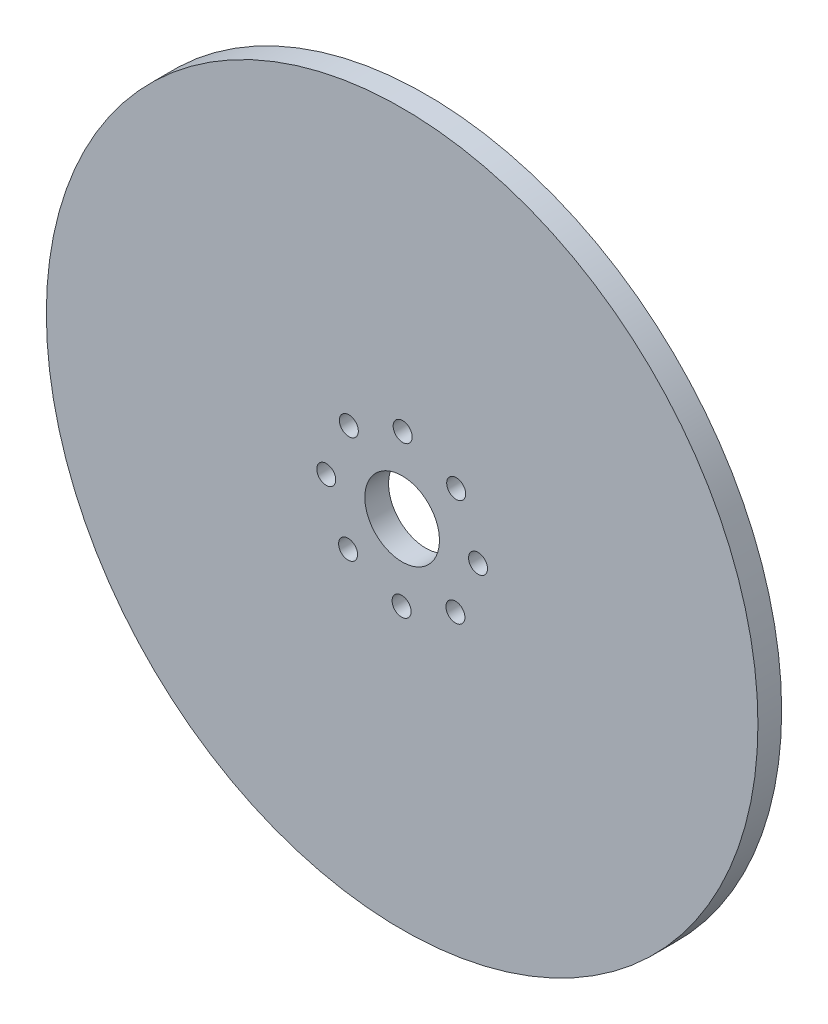
ISO-10303-21;
HEADER;
FILE_DESCRIPTION(('STEP AP214'),'2;1');
FILE_NAME('part.step','',(''),(''),'','','');
FILE_SCHEMA(('AUTOMOTIVE_DESIGN { 1 0 10303 214 1 1 1 1 }'));
ENDSEC;
DATA;
#1=APPLICATION_CONTEXT('core data for automotive mechanical design processes');
#2=APPLICATION_PROTOCOL_DEFINITION('international standard','automotive_design',2000,#1);
#3=PRODUCT_CONTEXT('',#1,'mechanical');
#4=PRODUCT('Part','Part','',(#3));
#5=PRODUCT_RELATED_PRODUCT_CATEGORY('part','',(#4));
#6=PRODUCT_DEFINITION_FORMATION('','',#4);
#7=PRODUCT_DEFINITION_CONTEXT('part definition',#1,'design');
#8=PRODUCT_DEFINITION('design','',#6,#7);
#9=PRODUCT_DEFINITION_SHAPE('','',#8);
#10=(LENGTH_UNIT() NAMED_UNIT(*) SI_UNIT(.MILLI.,.METRE.));
#11=(NAMED_UNIT(*) PLANE_ANGLE_UNIT() SI_UNIT($,.RADIAN.));
#12=(NAMED_UNIT(*) SI_UNIT($,.STERADIAN.) SOLID_ANGLE_UNIT());
#13=UNCERTAINTY_MEASURE_WITH_UNIT(LENGTH_MEASURE(1.E-05),#10,'distance_accuracy_value','');
#14=(GEOMETRIC_REPRESENTATION_CONTEXT(3) GLOBAL_UNCERTAINTY_ASSIGNED_CONTEXT((#13)) GLOBAL_UNIT_ASSIGNED_CONTEXT((#10,
#11,#12)) REPRESENTATION_CONTEXT('',''));
#15=CARTESIAN_POINT('',(0.,0.,0.));
#16=DIRECTION('',(0.,0.,1.));
#17=DIRECTION('',(1.,0.,0.));
#18=AXIS2_PLACEMENT_3D('',#15,#16,#17);
#19=CARTESIAN_POINT('',(0.,0.,2.5));
#20=DIRECTION('',(0.,0.,-1.));
#21=DIRECTION('',(-1.,0.,0.));
#22=AXIS2_PLACEMENT_3D('',#19,#20,#21);
#23=CYLINDRICAL_SURFACE('',#22,37.5);
#24=CARTESIAN_POINT('',(0.,0.,2.5));
#25=DIRECTION('',(0.,0.,1.));
#26=DIRECTION('',(1.,0.,0.));
#27=AXIS2_PLACEMENT_3D('',#24,#25,#26);
#28=CIRCLE('',#27,37.5);
#29=CARTESIAN_POINT('',(37.5,0.,2.5));
#30=VERTEX_POINT('',#29);
#31=EDGE_CURVE('E10',#30,#30,#28,.T.);
#32=ORIENTED_EDGE('',*,*,#31,.F.);
#33=EDGE_LOOP('',(#32));
#34=FACE_BOUND('',#33,.T.);
#35=CARTESIAN_POINT('',(0.,0.,0.));
#36=DIRECTION('',(0.,0.,1.));
#37=DIRECTION('',(1.,0.,0.));
#38=AXIS2_PLACEMENT_3D('',#35,#36,#37);
#39=CIRCLE('',#38,37.5);
#40=CARTESIAN_POINT('',(37.5,0.,0.));
#41=VERTEX_POINT('',#40);
#42=EDGE_CURVE('E40',#41,#41,#39,.T.);
#43=ORIENTED_EDGE('',*,*,#42,.T.);
#44=EDGE_LOOP('',(#43));
#45=FACE_BOUND('',#44,.T.);
#46=ADVANCED_FACE('F37',(#34,#45),#23,.T.);
#47=CARTESIAN_POINT('',(0.,0.,2.5));
#48=DIRECTION('',(0.,0.,1.));
#49=DIRECTION('',(1.,0.,0.));
#50=AXIS2_PLACEMENT_3D('',#47,#48,#49);
#51=PLANE('',#50);
#52=CARTESIAN_POINT('',(-0.056499269216726,-7.99980048704828,2.5));
#53=DIRECTION('',(0.,0.,-1.));
#54=DIRECTION('',(-1.,0.,0.));
#55=AXIS2_PLACEMENT_3D('',#52,#53,#54);
#56=CIRCLE('',#55,0.999999999999998);
#57=CARTESIAN_POINT('',(-1.05649926921672,-7.99980048704828,2.5));
#58=VERTEX_POINT('',#57);
#59=EDGE_CURVE('E74',#58,#58,#56,.T.);
#60=ORIENTED_EDGE('',*,*,#59,.T.);
#61=EDGE_LOOP('',(#60));
#62=FACE_BOUND('',#61,.T.);
#63=CARTESIAN_POINT('',(5.61676215613567,-5.69666418892614,2.5));
#64=DIRECTION('',(0.,0.,-1.));
#65=DIRECTION('',(-1.,0.,0.));
#66=AXIS2_PLACEMENT_3D('',#63,#64,#65);
#67=CIRCLE('',#66,0.999999999999998);
#68=CARTESIAN_POINT('',(4.61676215613568,-5.69666418892614,2.5));
#69=VERTEX_POINT('',#68);
#70=EDGE_CURVE('E68',#69,#69,#67,.T.);
#71=ORIENTED_EDGE('',*,*,#70,.T.);
#72=EDGE_LOOP('',(#71));
#73=FACE_BOUND('',#72,.T.);
#74=CARTESIAN_POINT('',(7.99980048704828,-0.0564992692167239,2.5));
#75=DIRECTION('',(0.,0.,-1.));
#76=DIRECTION('',(-1.,0.,0.));
#77=AXIS2_PLACEMENT_3D('',#74,#75,#76);
#78=CIRCLE('',#77,1.);
#79=CARTESIAN_POINT('',(6.99980048704828,-0.0564992692167239,2.5));
#80=VERTEX_POINT('',#79);
#81=EDGE_CURVE('E62',#80,#80,#78,.T.);
#82=ORIENTED_EDGE('',*,*,#81,.T.);
#83=EDGE_LOOP('',(#82));
#84=FACE_BOUND('',#83,.T.);
#85=CARTESIAN_POINT('',(5.69666418892613,5.61676215613568,2.5));
#86=DIRECTION('',(0.,0.,-1.));
#87=DIRECTION('',(-1.,0.,0.));
#88=AXIS2_PLACEMENT_3D('',#85,#86,#87);
#89=CIRCLE('',#88,0.999999999999998);
#90=CARTESIAN_POINT('',(4.69666418892614,5.61676215613568,2.5));
#91=VERTEX_POINT('',#90);
#92=EDGE_CURVE('E55',#91,#91,#89,.T.);
#93=ORIENTED_EDGE('',*,*,#92,.T.);
#94=EDGE_LOOP('',(#93));
#95=FACE_BOUND('',#94,.T.);
#96=CARTESIAN_POINT('',(0.0564992692167274,7.99980048704829,2.5));
#97=DIRECTION('',(0.,0.,-1.));
#98=DIRECTION('',(-1.,0.,0.));
#99=AXIS2_PLACEMENT_3D('',#96,#97,#98);
#100=CIRCLE('',#99,1.00109015032874);
#101=CARTESIAN_POINT('',(-0.944590881112016,7.99980048704829,2.5));
#102=VERTEX_POINT('',#101);
#103=EDGE_CURVE('E97',#102,#102,#100,.T.);
#104=ORIENTED_EDGE('',*,*,#103,.T.);
#105=EDGE_LOOP('',(#104));
#106=FACE_BOUND('',#105,.T.);
#107=CARTESIAN_POINT('',(-5.61676215613568,5.69666418892614,2.5));
#108=DIRECTION('',(0.,0.,-1.));
#109=DIRECTION('',(-1.,0.,0.));
#110=AXIS2_PLACEMENT_3D('',#107,#108,#109);
#111=CIRCLE('',#110,0.999999999999998);
#112=CARTESIAN_POINT('',(-6.61676215613568,5.69666418892614,2.5));
#113=VERTEX_POINT('',#112);
#114=EDGE_CURVE('E91',#113,#113,#111,.T.);
#115=ORIENTED_EDGE('',*,*,#114,.T.);
#116=EDGE_LOOP('',(#115));
#117=FACE_BOUND('',#116,.T.);
#118=CARTESIAN_POINT('',(-7.99980048704829,0.0564992692167266,2.5));
#119=DIRECTION('',(0.,0.,-1.));
#120=DIRECTION('',(-1.,0.,0.));
#121=AXIS2_PLACEMENT_3D('',#118,#119,#120);
#122=CIRCLE('',#121,1.);
#123=CARTESIAN_POINT('',(-8.99980048704829,0.0564992692167266,2.5));
#124=VERTEX_POINT('',#123);
#125=EDGE_CURVE('E85',#124,#124,#122,.T.);
#126=ORIENTED_EDGE('',*,*,#125,.T.);
#127=EDGE_LOOP('',(#126));
#128=FACE_BOUND('',#127,.T.);
#129=CARTESIAN_POINT('',(-5.69666418892614,-5.61676215613568,2.5));
#130=DIRECTION('',(0.,0.,-1.));
#131=DIRECTION('',(-1.,0.,0.));
#132=AXIS2_PLACEMENT_3D('',#129,#130,#131);
#133=CIRCLE('',#132,1.);
#134=CARTESIAN_POINT('',(-6.69666418892614,-5.61676215613568,2.5));
#135=VERTEX_POINT('',#134);
#136=EDGE_CURVE('E79',#135,#135,#133,.T.);
#137=ORIENTED_EDGE('',*,*,#136,.T.);
#138=EDGE_LOOP('',(#137));
#139=FACE_BOUND('',#138,.T.);
#140=CARTESIAN_POINT('',(0.,0.,2.5));
#141=DIRECTION('',(0.,0.,-1.));
#142=DIRECTION('',(-1.,0.,0.));
#143=AXIS2_PLACEMENT_3D('',#140,#141,#142);
#144=CIRCLE('',#143,3.93322231222539);
#145=CARTESIAN_POINT('',(-3.93322231222539,0.,2.5));
#146=VERTEX_POINT('',#145);
#147=EDGE_CURVE('E47',#146,#146,#144,.T.);
#148=ORIENTED_EDGE('',*,*,#147,.T.);
#149=EDGE_LOOP('',(#148));
#150=FACE_BOUND('',#149,.T.);
#151=ORIENTED_EDGE('',*,*,#31,.T.);
#152=EDGE_LOOP('',(#151));
#153=FACE_BOUND('',#152,.T.);
#154=ADVANCED_FACE('F109',(#62,#73,#84,#95,#106,#117,#128,#139,#150,#153),#51,.T.);
#155=CARTESIAN_POINT('',(0.,0.,0.));
#156=DIRECTION('',(0.,0.,1.));
#157=DIRECTION('',(1.,0.,0.));
#158=AXIS2_PLACEMENT_3D('',#155,#156,#157);
#159=PLANE('',#158);
#160=CARTESIAN_POINT('',(-0.056499269216726,-7.99980048704828,0.));
#161=DIRECTION('',(0.,0.,-1.));
#162=DIRECTION('',(-1.,0.,0.));
#163=AXIS2_PLACEMENT_3D('',#160,#161,#162);
#164=CIRCLE('',#163,0.999999999999998);
#165=CARTESIAN_POINT('',(-1.05649926921672,-7.99980048704828,0.));
#166=VERTEX_POINT('',#165);
#167=EDGE_CURVE('E52',#166,#166,#164,.T.);
#168=ORIENTED_EDGE('',*,*,#167,.F.);
#169=EDGE_LOOP('',(#168));
#170=FACE_BOUND('',#169,.T.);
#171=CARTESIAN_POINT('',(5.61676215613567,-5.69666418892614,0.));
#172=DIRECTION('',(0.,0.,-1.));
#173=DIRECTION('',(-1.,0.,0.));
#174=AXIS2_PLACEMENT_3D('',#171,#172,#173);
#175=CIRCLE('',#174,0.999999999999998);
#176=CARTESIAN_POINT('',(4.61676215613568,-5.69666418892614,0.));
#177=VERTEX_POINT('',#176);
#178=EDGE_CURVE('E71',#177,#177,#175,.T.);
#179=ORIENTED_EDGE('',*,*,#178,.F.);
#180=EDGE_LOOP('',(#179));
#181=FACE_BOUND('',#180,.T.);
#182=CARTESIAN_POINT('',(7.99980048704828,-0.0564992692167239,0.));
#183=DIRECTION('',(0.,0.,-1.));
#184=DIRECTION('',(-1.,0.,0.));
#185=AXIS2_PLACEMENT_3D('',#182,#183,#184);
#186=CIRCLE('',#185,1.);
#187=CARTESIAN_POINT('',(6.99980048704828,-0.0564992692167239,0.));
#188=VERTEX_POINT('',#187);
#189=EDGE_CURVE('E65',#188,#188,#186,.T.);
#190=ORIENTED_EDGE('',*,*,#189,.F.);
#191=EDGE_LOOP('',(#190));
#192=FACE_BOUND('',#191,.T.);
#193=CARTESIAN_POINT('',(5.69666418892613,5.61676215613568,0.));
#194=DIRECTION('',(0.,0.,-1.));
#195=DIRECTION('',(-1.,0.,0.));
#196=AXIS2_PLACEMENT_3D('',#193,#194,#195);
#197=CIRCLE('',#196,0.999999999999998);
#198=CARTESIAN_POINT('',(4.69666418892614,5.61676215613568,0.));
#199=VERTEX_POINT('',#198);
#200=EDGE_CURVE('E58',#199,#199,#197,.T.);
#201=ORIENTED_EDGE('',*,*,#200,.F.);
#202=EDGE_LOOP('',(#201));
#203=FACE_BOUND('',#202,.T.);
#204=CARTESIAN_POINT('',(0.0564992692167274,7.99980048704829,0.));
#205=DIRECTION('',(0.,0.,-1.));
#206=DIRECTION('',(-1.,0.,0.));
#207=AXIS2_PLACEMENT_3D('',#204,#205,#206);
#208=CIRCLE('',#207,1.00109015032874);
#209=CARTESIAN_POINT('',(-0.944590881112016,7.99980048704829,0.));
#210=VERTEX_POINT('',#209);
#211=EDGE_CURVE('E59',#210,#210,#208,.T.);
#212=ORIENTED_EDGE('',*,*,#211,.F.);
#213=EDGE_LOOP('',(#212));
#214=FACE_BOUND('',#213,.T.);
#215=CARTESIAN_POINT('',(-5.61676215613568,5.69666418892614,0.));
#216=DIRECTION('',(0.,0.,-1.));
#217=DIRECTION('',(-1.,0.,0.));
#218=AXIS2_PLACEMENT_3D('',#215,#216,#217);
#219=CIRCLE('',#218,0.999999999999998);
#220=CARTESIAN_POINT('',(-6.61676215613568,5.69666418892614,0.));
#221=VERTEX_POINT('',#220);
#222=EDGE_CURVE('E94',#221,#221,#219,.T.);
#223=ORIENTED_EDGE('',*,*,#222,.F.);
#224=EDGE_LOOP('',(#223));
#225=FACE_BOUND('',#224,.T.);
#226=CARTESIAN_POINT('',(-7.99980048704829,0.0564992692167266,0.));
#227=DIRECTION('',(0.,0.,-1.));
#228=DIRECTION('',(-1.,0.,0.));
#229=AXIS2_PLACEMENT_3D('',#226,#227,#228);
#230=CIRCLE('',#229,1.);
#231=CARTESIAN_POINT('',(-8.99980048704829,0.0564992692167266,0.));
#232=VERTEX_POINT('',#231);
#233=EDGE_CURVE('E88',#232,#232,#230,.T.);
#234=ORIENTED_EDGE('',*,*,#233,.F.);
#235=EDGE_LOOP('',(#234));
#236=FACE_BOUND('',#235,.T.);
#237=CARTESIAN_POINT('',(-5.69666418892614,-5.61676215613568,0.));
#238=DIRECTION('',(0.,0.,-1.));
#239=DIRECTION('',(-1.,0.,0.));
#240=AXIS2_PLACEMENT_3D('',#237,#238,#239);
#241=CIRCLE('',#240,1.);
#242=CARTESIAN_POINT('',(-6.69666418892614,-5.61676215613568,0.));
#243=VERTEX_POINT('',#242);
#244=EDGE_CURVE('E82',#243,#243,#241,.T.);
#245=ORIENTED_EDGE('',*,*,#244,.F.);
#246=EDGE_LOOP('',(#245));
#247=FACE_BOUND('',#246,.T.);
#248=CARTESIAN_POINT('',(0.,0.,0.));
#249=DIRECTION('',(0.,0.,-1.));
#250=DIRECTION('',(-1.,0.,0.));
#251=AXIS2_PLACEMENT_3D('',#248,#249,#250);
#252=CIRCLE('',#251,3.93322231222539);
#253=CARTESIAN_POINT('',(-3.93322231222539,0.,0.));
#254=VERTEX_POINT('',#253);
#255=EDGE_CURVE('E49',#254,#254,#252,.T.);
#256=ORIENTED_EDGE('',*,*,#255,.F.);
#257=EDGE_LOOP('',(#256));
#258=FACE_BOUND('',#257,.T.);
#259=ORIENTED_EDGE('',*,*,#42,.F.);
#260=EDGE_LOOP('',(#259));
#261=FACE_BOUND('',#260,.T.);
#262=ADVANCED_FACE('F105',(#170,#181,#192,#203,#214,#225,#236,#247,#258,#261),#159,.F.);
#263=CARTESIAN_POINT('',(0.,0.,2.5));
#264=DIRECTION('',(0.,0.,-1.));
#265=DIRECTION('',(-1.,0.,0.));
#266=AXIS2_PLACEMENT_3D('',#263,#264,#265);
#267=CYLINDRICAL_SURFACE('',#266,3.93322231222539);
#268=ORIENTED_EDGE('',*,*,#147,.F.);
#269=EDGE_LOOP('',(#268));
#270=FACE_BOUND('',#269,.T.);
#271=ORIENTED_EDGE('',*,*,#255,.T.);
#272=EDGE_LOOP('',(#271));
#273=FACE_BOUND('',#272,.T.);
#274=ADVANCED_FACE('F108',(#270,#273),#267,.F.);
#275=CARTESIAN_POINT('',(-5.69666418892614,-5.61676215613568,2.5));
#276=DIRECTION('',(0.,0.,-1.));
#277=DIRECTION('',(-1.,0.,0.));
#278=AXIS2_PLACEMENT_3D('',#275,#276,#277);
#279=CYLINDRICAL_SURFACE('',#278,1.);
#280=ORIENTED_EDGE('',*,*,#136,.F.);
#281=EDGE_LOOP('',(#280));
#282=FACE_BOUND('',#281,.T.);
#283=ORIENTED_EDGE('',*,*,#244,.T.);
#284=EDGE_LOOP('',(#283));
#285=FACE_BOUND('',#284,.T.);
#286=ADVANCED_FACE('F134',(#282,#285),#279,.F.);
#287=CARTESIAN_POINT('',(-7.99980048704829,0.0564992692167266,2.5));
#288=DIRECTION('',(0.,0.,-1.));
#289=DIRECTION('',(-1.,0.,0.));
#290=AXIS2_PLACEMENT_3D('',#287,#288,#289);
#291=CYLINDRICAL_SURFACE('',#290,1.);
#292=ORIENTED_EDGE('',*,*,#125,.F.);
#293=EDGE_LOOP('',(#292));
#294=FACE_BOUND('',#293,.T.);
#295=ORIENTED_EDGE('',*,*,#233,.T.);
#296=EDGE_LOOP('',(#295));
#297=FACE_BOUND('',#296,.T.);
#298=ADVANCED_FACE('F154',(#294,#297),#291,.F.);
#299=CARTESIAN_POINT('',(-5.61676215613568,5.69666418892614,2.5));
#300=DIRECTION('',(0.,0.,-1.));
#301=DIRECTION('',(-1.,0.,0.));
#302=AXIS2_PLACEMENT_3D('',#299,#300,#301);
#303=CYLINDRICAL_SURFACE('',#302,0.999999999999998);
#304=ORIENTED_EDGE('',*,*,#114,.F.);
#305=EDGE_LOOP('',(#304));
#306=FACE_BOUND('',#305,.T.);
#307=ORIENTED_EDGE('',*,*,#222,.T.);
#308=EDGE_LOOP('',(#307));
#309=FACE_BOUND('',#308,.T.);
#310=ADVANCED_FACE('F158',(#306,#309),#303,.F.);
#311=CARTESIAN_POINT('',(0.0564992692167274,7.99980048704829,2.5));
#312=DIRECTION('',(0.,0.,-1.));
#313=DIRECTION('',(-1.,0.,0.));
#314=AXIS2_PLACEMENT_3D('',#311,#312,#313);
#315=CYLINDRICAL_SURFACE('',#314,1.00109015032874);
#316=ORIENTED_EDGE('',*,*,#103,.F.);
#317=EDGE_LOOP('',(#316));
#318=FACE_BOUND('',#317,.T.);
#319=ORIENTED_EDGE('',*,*,#211,.T.);
#320=EDGE_LOOP('',(#319));
#321=FACE_BOUND('',#320,.T.);
#322=ADVANCED_FACE('F103',(#318,#321),#315,.F.);
#323=CARTESIAN_POINT('',(5.69666418892613,5.61676215613568,2.5));
#324=DIRECTION('',(0.,0.,-1.));
#325=DIRECTION('',(-1.,0.,0.));
#326=AXIS2_PLACEMENT_3D('',#323,#324,#325);
#327=CYLINDRICAL_SURFACE('',#326,0.999999999999998);
#328=ORIENTED_EDGE('',*,*,#92,.F.);
#329=EDGE_LOOP('',(#328));
#330=FACE_BOUND('',#329,.T.);
#331=ORIENTED_EDGE('',*,*,#200,.T.);
#332=EDGE_LOOP('',(#331));
#333=FACE_BOUND('',#332,.T.);
#334=ADVANCED_FACE('F136',(#330,#333),#327,.F.);
#335=CARTESIAN_POINT('',(7.99980048704828,-0.0564992692167239,2.5));
#336=DIRECTION('',(0.,0.,-1.));
#337=DIRECTION('',(-1.,0.,0.));
#338=AXIS2_PLACEMENT_3D('',#335,#336,#337);
#339=CYLINDRICAL_SURFACE('',#338,1.);
#340=ORIENTED_EDGE('',*,*,#81,.F.);
#341=EDGE_LOOP('',(#340));
#342=FACE_BOUND('',#341,.T.);
#343=ORIENTED_EDGE('',*,*,#189,.T.);
#344=EDGE_LOOP('',(#343));
#345=FACE_BOUND('',#344,.T.);
#346=ADVANCED_FACE('F139',(#342,#345),#339,.F.);
#347=CARTESIAN_POINT('',(5.61676215613567,-5.69666418892614,2.5));
#348=DIRECTION('',(0.,0.,-1.));
#349=DIRECTION('',(-1.,0.,0.));
#350=AXIS2_PLACEMENT_3D('',#347,#348,#349);
#351=CYLINDRICAL_SURFACE('',#350,0.999999999999998);
#352=ORIENTED_EDGE('',*,*,#70,.F.);
#353=EDGE_LOOP('',(#352));
#354=FACE_BOUND('',#353,.T.);
#355=ORIENTED_EDGE('',*,*,#178,.T.);
#356=EDGE_LOOP('',(#355));
#357=FACE_BOUND('',#356,.T.);
#358=ADVANCED_FACE('F143',(#354,#357),#351,.F.);
#359=CARTESIAN_POINT('',(-0.056499269216726,-7.99980048704828,2.5));
#360=DIRECTION('',(0.,0.,-1.));
#361=DIRECTION('',(-1.,0.,0.));
#362=AXIS2_PLACEMENT_3D('',#359,#360,#361);
#363=CYLINDRICAL_SURFACE('',#362,0.999999999999998);
#364=ORIENTED_EDGE('',*,*,#59,.F.);
#365=EDGE_LOOP('',(#364));
#366=FACE_BOUND('',#365,.T.);
#367=ORIENTED_EDGE('',*,*,#167,.T.);
#368=EDGE_LOOP('',(#367));
#369=FACE_BOUND('',#368,.T.);
#370=ADVANCED_FACE('F147',(#366,#369),#363,.F.);
#371=CLOSED_SHELL('',(#46,#154,#262,#274,#286,#298,#310,#322,#334,#346,#358,#370));
#372=MANIFOLD_SOLID_BREP('B2',#371);
#373=ADVANCED_BREP_SHAPE_REPRESENTATION('',(#18,#372),#14);
#374=SHAPE_DEFINITION_REPRESENTATION(#9,#373);
ENDSEC;
END-ISO-10303-21;
